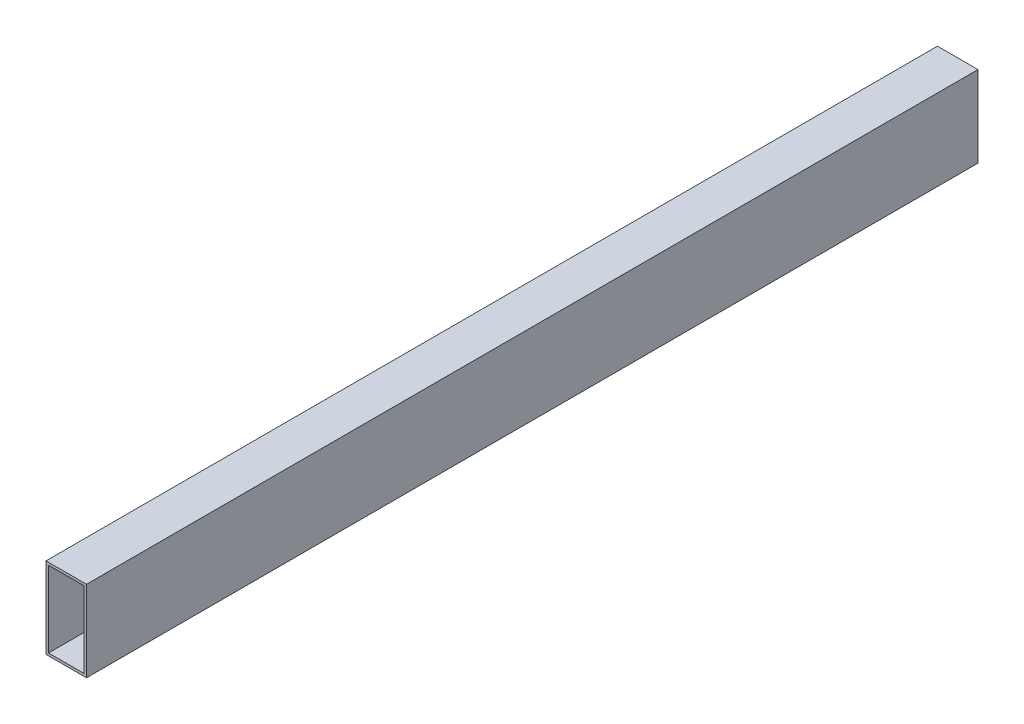
ISO-10303-21;
HEADER;
FILE_DESCRIPTION(('STEP AP214'),'2;1');
FILE_NAME('part.step','',(''),(''),'','','');
FILE_SCHEMA(('AUTOMOTIVE_DESIGN { 1 0 10303 214 1 1 1 1 }'));
ENDSEC;
DATA;
#1=APPLICATION_CONTEXT('core data for automotive mechanical design processes');
#2=APPLICATION_PROTOCOL_DEFINITION('international standard','automotive_design',2000,#1);
#3=PRODUCT_CONTEXT('',#1,'mechanical');
#4=PRODUCT('Part','Part','',(#3));
#5=PRODUCT_RELATED_PRODUCT_CATEGORY('part','',(#4));
#6=PRODUCT_DEFINITION_FORMATION('','',#4);
#7=PRODUCT_DEFINITION_CONTEXT('part definition',#1,'design');
#8=PRODUCT_DEFINITION('design','',#6,#7);
#9=PRODUCT_DEFINITION_SHAPE('','',#8);
#10=(LENGTH_UNIT() NAMED_UNIT(*) SI_UNIT(.MILLI.,.METRE.));
#11=(NAMED_UNIT(*) PLANE_ANGLE_UNIT() SI_UNIT($,.RADIAN.));
#12=(NAMED_UNIT(*) SI_UNIT($,.STERADIAN.) SOLID_ANGLE_UNIT());
#13=UNCERTAINTY_MEASURE_WITH_UNIT(LENGTH_MEASURE(1.E-05),#10,'distance_accuracy_value','');
#14=(GEOMETRIC_REPRESENTATION_CONTEXT(3) GLOBAL_UNCERTAINTY_ASSIGNED_CONTEXT((#13)) GLOBAL_UNIT_ASSIGNED_CONTEXT((#10,
#11,#12)) REPRESENTATION_CONTEXT('',''));
#15=CARTESIAN_POINT('',(0.,0.,0.));
#16=DIRECTION('',(0.,0.,1.));
#17=DIRECTION('',(1.,0.,0.));
#18=AXIS2_PLACEMENT_3D('',#15,#16,#17);
#19=CARTESIAN_POINT('',(0.,0.,279.4));
#20=DIRECTION('',(0.,0.,-1.));
#21=DIRECTION('',(-1.,0.,0.));
#22=AXIS2_PLACEMENT_3D('',#19,#20,#21);
#23=PLANE('',#22);
#24=DIRECTION('',(0.,1.,0.));
#25=VECTOR('',#24,1.);
#26=CARTESIAN_POINT('',(12.7,-25.4,279.4));
#27=LINE('',#26,#25);
#28=CARTESIAN_POINT('',(12.7,-25.4,279.4));
#29=VERTEX_POINT('',#28);
#30=CARTESIAN_POINT('',(12.7,25.4,279.4));
#31=VERTEX_POINT('',#30);
#32=EDGE_CURVE('E153',#29,#31,#27,.T.);
#33=ORIENTED_EDGE('',*,*,#32,.T.);
#34=DIRECTION('',(-1.,0.,0.));
#35=VECTOR('',#34,1.);
#36=CARTESIAN_POINT('',(-12.7,25.4,279.4));
#37=LINE('',#36,#35);
#38=CARTESIAN_POINT('',(-12.7,25.4,279.4));
#39=VERTEX_POINT('',#38);
#40=EDGE_CURVE('E157',#31,#39,#37,.T.);
#41=ORIENTED_EDGE('',*,*,#40,.T.);
#42=DIRECTION('',(0.,-1.,0.));
#43=VECTOR('',#42,1.);
#44=CARTESIAN_POINT('',(-12.7,-25.4,279.4));
#45=LINE('',#44,#43);
#46=CARTESIAN_POINT('',(-12.7,-25.4,279.4));
#47=VERTEX_POINT('',#46);
#48=EDGE_CURVE('E161',#39,#47,#45,.T.);
#49=ORIENTED_EDGE('',*,*,#48,.T.);
#50=DIRECTION('',(1.,0.,0.));
#51=VECTOR('',#50,1.);
#52=CARTESIAN_POINT('',(-12.7,-25.4,279.4));
#53=LINE('',#52,#51);
#54=EDGE_CURVE('E164',#47,#29,#53,.T.);
#55=ORIENTED_EDGE('',*,*,#54,.T.);
#56=EDGE_LOOP('',(#33,#41,#49,#55));
#57=FACE_BOUND('',#56,.T.);
#58=DIRECTION('',(1.,0.,0.));
#59=VECTOR('',#58,1.);
#60=CARTESIAN_POINT('',(-11.1125,-23.8125,279.4));
#61=LINE('',#60,#59);
#62=CARTESIAN_POINT('',(-11.1125,-23.8125,279.4));
#63=VERTEX_POINT('',#62);
#64=CARTESIAN_POINT('',(11.1125,-23.8125,279.4));
#65=VERTEX_POINT('',#64);
#66=EDGE_CURVE('E105',#63,#65,#61,.T.);
#67=ORIENTED_EDGE('',*,*,#66,.F.);
#68=DIRECTION('',(0.,-1.,0.));
#69=VECTOR('',#68,1.);
#70=CARTESIAN_POINT('',(-11.1125,-23.8125,279.4));
#71=LINE('',#70,#69);
#72=CARTESIAN_POINT('',(-11.1125,23.8125,279.4));
#73=VERTEX_POINT('',#72);
#74=EDGE_CURVE('E131',#73,#63,#71,.T.);
#75=ORIENTED_EDGE('',*,*,#74,.F.);
#76=DIRECTION('',(-1.,0.,0.));
#77=VECTOR('',#76,1.);
#78=CARTESIAN_POINT('',(-11.1125,23.8125,279.4));
#79=LINE('',#78,#77);
#80=CARTESIAN_POINT('',(11.1125,23.8125,279.4));
#81=VERTEX_POINT('',#80);
#82=EDGE_CURVE('E127',#81,#73,#79,.T.);
#83=ORIENTED_EDGE('',*,*,#82,.F.);
#84=DIRECTION('',(0.,1.,0.));
#85=VECTOR('',#84,1.);
#86=CARTESIAN_POINT('',(11.1125,-23.8125,279.4));
#87=LINE('',#86,#85);
#88=EDGE_CURVE('E114',#65,#81,#87,.T.);
#89=ORIENTED_EDGE('',*,*,#88,.F.);
#90=EDGE_LOOP('',(#67,#75,#83,#89));
#91=FACE_BOUND('',#90,.T.);
#92=ADVANCED_FACE('F39',(#57,#91),#23,.F.);
#93=CARTESIAN_POINT('',(0.,0.,-279.4));
#94=DIRECTION('',(0.,0.,-1.));
#95=DIRECTION('',(-1.,0.,0.));
#96=AXIS2_PLACEMENT_3D('',#93,#94,#95);
#97=PLANE('',#96);
#98=DIRECTION('',(0.,1.,0.));
#99=VECTOR('',#98,1.);
#100=CARTESIAN_POINT('',(12.7,-25.4,-279.4));
#101=LINE('',#100,#99);
#102=CARTESIAN_POINT('',(12.7,-25.4,-279.4));
#103=VERTEX_POINT('',#102);
#104=CARTESIAN_POINT('',(12.7,25.4,-279.4));
#105=VERTEX_POINT('',#104);
#106=EDGE_CURVE('E123',#103,#105,#101,.T.);
#107=ORIENTED_EDGE('',*,*,#106,.F.);
#108=DIRECTION('',(1.,0.,0.));
#109=VECTOR('',#108,1.);
#110=CARTESIAN_POINT('',(-12.7,-25.4,-279.4));
#111=LINE('',#110,#109);
#112=CARTESIAN_POINT('',(-12.7,-25.4,-279.4));
#113=VERTEX_POINT('',#112);
#114=EDGE_CURVE('E158',#113,#103,#111,.T.);
#115=ORIENTED_EDGE('',*,*,#114,.F.);
#116=DIRECTION('',(0.,-1.,0.));
#117=VECTOR('',#116,1.);
#118=CARTESIAN_POINT('',(-12.7,-25.4,-279.4));
#119=LINE('',#118,#117);
#120=CARTESIAN_POINT('',(-12.7,25.4,-279.4));
#121=VERTEX_POINT('',#120);
#122=EDGE_CURVE('E174',#121,#113,#119,.T.);
#123=ORIENTED_EDGE('',*,*,#122,.F.);
#124=DIRECTION('',(-1.,0.,0.));
#125=VECTOR('',#124,1.);
#126=CARTESIAN_POINT('',(-12.7,25.4,-279.4));
#127=LINE('',#126,#125);
#128=EDGE_CURVE('E171',#105,#121,#127,.T.);
#129=ORIENTED_EDGE('',*,*,#128,.F.);
#130=EDGE_LOOP('',(#107,#115,#123,#129));
#131=FACE_BOUND('',#130,.T.);
#132=DIRECTION('',(0.,-1.,0.));
#133=VECTOR('',#132,1.);
#134=CARTESIAN_POINT('',(-11.1125,-23.8125,-279.4));
#135=LINE('',#134,#133);
#136=CARTESIAN_POINT('',(-11.1125,23.8125,-279.4));
#137=VERTEX_POINT('',#136);
#138=CARTESIAN_POINT('',(-11.1125,-23.8125,-279.4));
#139=VERTEX_POINT('',#138);
#140=EDGE_CURVE('E115',#137,#139,#135,.T.);
#141=ORIENTED_EDGE('',*,*,#140,.T.);
#142=DIRECTION('',(1.,0.,0.));
#143=VECTOR('',#142,1.);
#144=CARTESIAN_POINT('',(-11.1125,-23.8125,-279.4));
#145=LINE('',#144,#143);
#146=CARTESIAN_POINT('',(11.1125,-23.8125,-279.4));
#147=VERTEX_POINT('',#146);
#148=EDGE_CURVE('E63',#139,#147,#145,.T.);
#149=ORIENTED_EDGE('',*,*,#148,.T.);
#150=DIRECTION('',(0.,1.,0.));
#151=VECTOR('',#150,1.);
#152=CARTESIAN_POINT('',(11.1125,-23.8125,-279.4));
#153=LINE('',#152,#151);
#154=CARTESIAN_POINT('',(11.1125,23.8125,-279.4));
#155=VERTEX_POINT('',#154);
#156=EDGE_CURVE('E121',#147,#155,#153,.T.);
#157=ORIENTED_EDGE('',*,*,#156,.T.);
#158=DIRECTION('',(-1.,0.,0.));
#159=VECTOR('',#158,1.);
#160=CARTESIAN_POINT('',(-11.1125,23.8125,-279.4));
#161=LINE('',#160,#159);
#162=EDGE_CURVE('E140',#155,#137,#161,.T.);
#163=ORIENTED_EDGE('',*,*,#162,.T.);
#164=EDGE_LOOP('',(#141,#149,#157,#163));
#165=FACE_BOUND('',#164,.T.);
#166=ADVANCED_FACE('F197',(#131,#165),#97,.T.);
#167=CARTESIAN_POINT('',(12.7,-25.4,279.4));
#168=DIRECTION('',(-1.,0.,0.));
#169=DIRECTION('',(0.,0.,1.));
#170=AXIS2_PLACEMENT_3D('',#167,#168,#169);
#171=PLANE('',#170);
#172=ORIENTED_EDGE('',*,*,#106,.T.);
#173=DIRECTION('',(0.,0.,-1.));
#174=VECTOR('',#173,1.);
#175=CARTESIAN_POINT('',(12.7,25.4,279.4));
#176=LINE('',#175,#174);
#177=EDGE_CURVE('E11',#31,#105,#176,.T.);
#178=ORIENTED_EDGE('',*,*,#177,.F.);
#179=ORIENTED_EDGE('',*,*,#32,.F.);
#180=DIRECTION('',(0.,0.,-1.));
#181=VECTOR('',#180,1.);
#182=CARTESIAN_POINT('',(12.7,-25.4,279.4));
#183=LINE('',#182,#181);
#184=EDGE_CURVE('E167',#29,#103,#183,.T.);
#185=ORIENTED_EDGE('',*,*,#184,.T.);
#186=EDGE_LOOP('',(#172,#178,#179,#185));
#187=FACE_BOUND('',#186,.T.);
#188=ADVANCED_FACE('F41',(#187),#171,.F.);
#189=CARTESIAN_POINT('',(-12.7,25.4,279.4));
#190=DIRECTION('',(0.,-1.,0.));
#191=DIRECTION('',(0.,0.,-1.));
#192=AXIS2_PLACEMENT_3D('',#189,#190,#191);
#193=PLANE('',#192);
#194=ORIENTED_EDGE('',*,*,#128,.T.);
#195=DIRECTION('',(0.,0.,-1.));
#196=VECTOR('',#195,1.);
#197=CARTESIAN_POINT('',(-12.7,25.4,279.4));
#198=LINE('',#197,#196);
#199=EDGE_CURVE('E48',#39,#121,#198,.T.);
#200=ORIENTED_EDGE('',*,*,#199,.F.);
#201=ORIENTED_EDGE('',*,*,#40,.F.);
#202=ORIENTED_EDGE('',*,*,#177,.T.);
#203=EDGE_LOOP('',(#194,#200,#201,#202));
#204=FACE_BOUND('',#203,.T.);
#205=ADVANCED_FACE('F207',(#204),#193,.F.);
#206=CARTESIAN_POINT('',(-12.7,-25.4,279.4));
#207=DIRECTION('',(1.,0.,0.));
#208=DIRECTION('',(0.,0.,-1.));
#209=AXIS2_PLACEMENT_3D('',#206,#207,#208);
#210=PLANE('',#209);
#211=ORIENTED_EDGE('',*,*,#122,.T.);
#212=DIRECTION('',(0.,0.,-1.));
#213=VECTOR('',#212,1.);
#214=CARTESIAN_POINT('',(-12.7,-25.4,279.4));
#215=LINE('',#214,#213);
#216=EDGE_CURVE('E182',#47,#113,#215,.T.);
#217=ORIENTED_EDGE('',*,*,#216,.F.);
#218=ORIENTED_EDGE('',*,*,#48,.F.);
#219=ORIENTED_EDGE('',*,*,#199,.T.);
#220=EDGE_LOOP('',(#211,#217,#218,#219));
#221=FACE_BOUND('',#220,.T.);
#222=ADVANCED_FACE('F191',(#221),#210,.F.);
#223=CARTESIAN_POINT('',(-12.7,-25.4,279.4));
#224=DIRECTION('',(0.,1.,0.));
#225=DIRECTION('',(0.,0.,1.));
#226=AXIS2_PLACEMENT_3D('',#223,#224,#225);
#227=PLANE('',#226);
#228=ORIENTED_EDGE('',*,*,#114,.T.);
#229=ORIENTED_EDGE('',*,*,#184,.F.);
#230=ORIENTED_EDGE('',*,*,#54,.F.);
#231=ORIENTED_EDGE('',*,*,#216,.T.);
#232=EDGE_LOOP('',(#228,#229,#230,#231));
#233=FACE_BOUND('',#232,.T.);
#234=ADVANCED_FACE('F201',(#233),#227,.F.);
#235=CARTESIAN_POINT('',(-11.1125,-23.8125,279.4));
#236=DIRECTION('',(0.,1.,0.));
#237=DIRECTION('',(0.,0.,1.));
#238=AXIS2_PLACEMENT_3D('',#235,#236,#237);
#239=PLANE('',#238);
#240=ORIENTED_EDGE('',*,*,#148,.F.);
#241=DIRECTION('',(0.,0.,-1.));
#242=VECTOR('',#241,1.);
#243=CARTESIAN_POINT('',(-11.1125,-23.8125,279.4));
#244=LINE('',#243,#242);
#245=EDGE_CURVE('E109',#63,#139,#244,.T.);
#246=ORIENTED_EDGE('',*,*,#245,.F.);
#247=ORIENTED_EDGE('',*,*,#66,.T.);
#248=DIRECTION('',(0.,0.,-1.));
#249=VECTOR('',#248,1.);
#250=CARTESIAN_POINT('',(11.1125,-23.8125,279.4));
#251=LINE('',#250,#249);
#252=EDGE_CURVE('E108',#65,#147,#251,.T.);
#253=ORIENTED_EDGE('',*,*,#252,.T.);
#254=EDGE_LOOP('',(#240,#246,#247,#253));
#255=FACE_BOUND('',#254,.T.);
#256=ADVANCED_FACE('F107',(#255),#239,.T.);
#257=CARTESIAN_POINT('',(11.1125,-23.8125,279.4));
#258=DIRECTION('',(-1.,0.,0.));
#259=DIRECTION('',(0.,-1.,0.));
#260=AXIS2_PLACEMENT_3D('',#257,#258,#259);
#261=PLANE('',#260);
#262=ORIENTED_EDGE('',*,*,#156,.F.);
#263=ORIENTED_EDGE('',*,*,#252,.F.);
#264=ORIENTED_EDGE('',*,*,#88,.T.);
#265=DIRECTION('',(0.,0.,-1.));
#266=VECTOR('',#265,1.);
#267=CARTESIAN_POINT('',(11.1125,23.8125,279.4));
#268=LINE('',#267,#266);
#269=EDGE_CURVE('E124',#81,#155,#268,.T.);
#270=ORIENTED_EDGE('',*,*,#269,.T.);
#271=EDGE_LOOP('',(#262,#263,#264,#270));
#272=FACE_BOUND('',#271,.T.);
#273=ADVANCED_FACE('F118',(#272),#261,.T.);
#274=CARTESIAN_POINT('',(-11.1125,23.8125,279.4));
#275=DIRECTION('',(0.,-1.,0.));
#276=DIRECTION('',(0.,0.,-1.));
#277=AXIS2_PLACEMENT_3D('',#274,#275,#276);
#278=PLANE('',#277);
#279=ORIENTED_EDGE('',*,*,#162,.F.);
#280=ORIENTED_EDGE('',*,*,#269,.F.);
#281=ORIENTED_EDGE('',*,*,#82,.T.);
#282=DIRECTION('',(0.,0.,-1.));
#283=VECTOR('',#282,1.);
#284=CARTESIAN_POINT('',(-11.1125,23.8125,279.4));
#285=LINE('',#284,#283);
#286=EDGE_CURVE('E55',#73,#137,#285,.T.);
#287=ORIENTED_EDGE('',*,*,#286,.T.);
#288=EDGE_LOOP('',(#279,#280,#281,#287));
#289=FACE_BOUND('',#288,.T.);
#290=ADVANCED_FACE('F230',(#289),#278,.T.);
#291=CARTESIAN_POINT('',(-11.1125,-23.8125,279.4));
#292=DIRECTION('',(1.,0.,0.));
#293=DIRECTION('',(0.,0.,-1.));
#294=AXIS2_PLACEMENT_3D('',#291,#292,#293);
#295=PLANE('',#294);
#296=ORIENTED_EDGE('',*,*,#140,.F.);
#297=ORIENTED_EDGE('',*,*,#286,.F.);
#298=ORIENTED_EDGE('',*,*,#74,.T.);
#299=ORIENTED_EDGE('',*,*,#245,.T.);
#300=EDGE_LOOP('',(#296,#297,#298,#299));
#301=FACE_BOUND('',#300,.T.);
#302=ADVANCED_FACE('F234',(#301),#295,.T.);
#303=CLOSED_SHELL('',(#92,#166,#188,#205,#222,#234,#256,#273,#290,#302));
#304=MANIFOLD_SOLID_BREP('B2',#303);
#305=ADVANCED_BREP_SHAPE_REPRESENTATION('',(#18,#304),#14);
#306=SHAPE_DEFINITION_REPRESENTATION(#9,#305);
ENDSEC;
END-ISO-10303-21;
